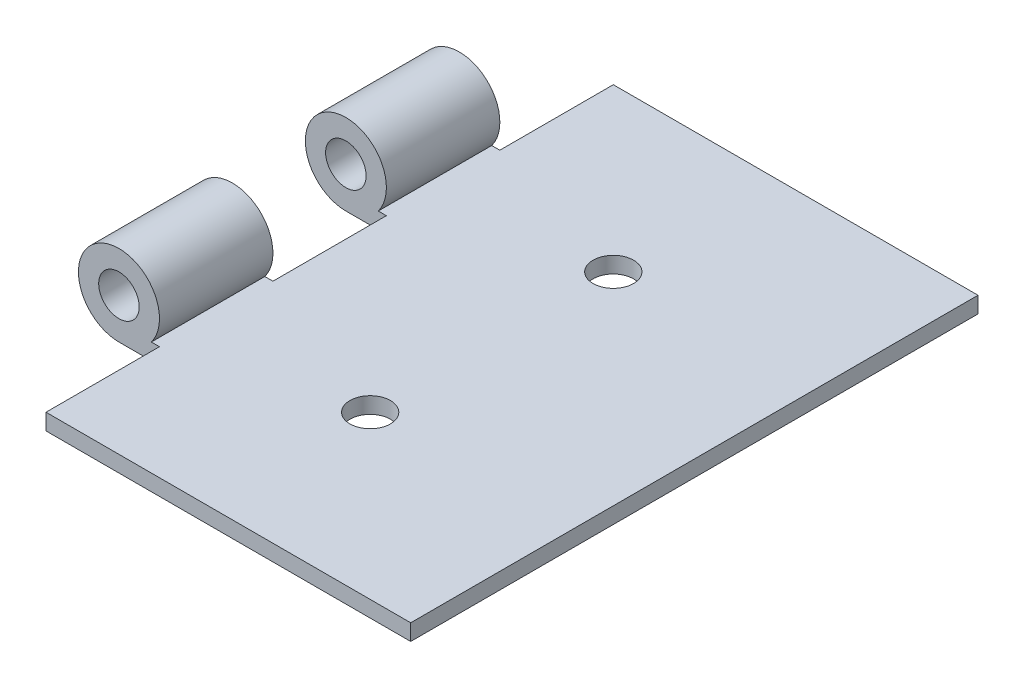
ISO-10303-21;
HEADER;
FILE_DESCRIPTION(('STEP AP214'),'2;1');
FILE_NAME('part.step','',(''),(''),'','','');
FILE_SCHEMA(('AUTOMOTIVE_DESIGN { 1 0 10303 214 1 1 1 1 }'));
ENDSEC;
DATA;
#1=APPLICATION_CONTEXT('core data for automotive mechanical design processes');
#2=APPLICATION_PROTOCOL_DEFINITION('international standard','automotive_design',2000,#1);
#3=PRODUCT_CONTEXT('',#1,'mechanical');
#4=PRODUCT('Part','Part','',(#3));
#5=PRODUCT_RELATED_PRODUCT_CATEGORY('part','',(#4));
#6=PRODUCT_DEFINITION_FORMATION('','',#4);
#7=PRODUCT_DEFINITION_CONTEXT('part definition',#1,'design');
#8=PRODUCT_DEFINITION('design','',#6,#7);
#9=PRODUCT_DEFINITION_SHAPE('','',#8);
#10=(LENGTH_UNIT() NAMED_UNIT(*) SI_UNIT(.MILLI.,.METRE.));
#11=(NAMED_UNIT(*) PLANE_ANGLE_UNIT() SI_UNIT($,.RADIAN.));
#12=(NAMED_UNIT(*) SI_UNIT($,.STERADIAN.) SOLID_ANGLE_UNIT());
#13=UNCERTAINTY_MEASURE_WITH_UNIT(LENGTH_MEASURE(1.E-05),#10,'distance_accuracy_value','');
#14=(GEOMETRIC_REPRESENTATION_CONTEXT(3) GLOBAL_UNCERTAINTY_ASSIGNED_CONTEXT((#13)) GLOBAL_UNIT_ASSIGNED_CONTEXT((#10,
#11,#12)) REPRESENTATION_CONTEXT('',''));
#15=CARTESIAN_POINT('',(0.,0.,0.));
#16=DIRECTION('',(0.,0.,1.));
#17=DIRECTION('',(1.,0.,0.));
#18=AXIS2_PLACEMENT_3D('',#15,#16,#17);
#19=CARTESIAN_POINT('',(-25.,5.,-49.142135623731));
#20=DIRECTION('',(0.,0.,1.));
#21=DIRECTION('',(1.,0.,0.));
#22=AXIS2_PLACEMENT_3D('',#19,#20,#21);
#23=CYLINDRICAL_SURFACE('',#22,5.);
#24=CARTESIAN_POINT('',(-25.,5.,7.00000000000001));
#25=DIRECTION('',(0.,0.,1.));
#26=DIRECTION('',(1.,0.,0.));
#27=AXIS2_PLACEMENT_3D('',#24,#25,#26);
#28=CIRCLE('',#27,5.);
#29=CARTESIAN_POINT('',(-25.,0.,7.00000000000001));
#30=VERTEX_POINT('',#29);
#31=CARTESIAN_POINT('',(-21.,2.,7.00000000000001));
#32=VERTEX_POINT('',#31);
#33=EDGE_CURVE('E204',#30,#32,#28,.F.);
#34=ORIENTED_EDGE('',*,*,#33,.F.);
#35=DIRECTION('',(0.,0.,1.));
#36=VECTOR('',#35,1.);
#37=CARTESIAN_POINT('',(-25.,0.,-35.));
#38=LINE('',#37,#36);
#39=CARTESIAN_POINT('',(-25.,0.,21.));
#40=VERTEX_POINT('',#39);
#41=EDGE_CURVE('E267',#30,#40,#38,.T.);
#42=ORIENTED_EDGE('',*,*,#41,.T.);
#43=CARTESIAN_POINT('',(-25.,5.,21.));
#44=DIRECTION('',(0.,0.,-1.));
#45=DIRECTION('',(-1.,0.,0.));
#46=AXIS2_PLACEMENT_3D('',#43,#44,#45);
#47=CIRCLE('',#46,5.);
#48=CARTESIAN_POINT('',(-21.,2.,21.));
#49=VERTEX_POINT('',#48);
#50=EDGE_CURVE('E197',#49,#40,#47,.F.);
#51=ORIENTED_EDGE('',*,*,#50,.F.);
#52=DIRECTION('',(0.,0.,1.));
#53=VECTOR('',#52,1.);
#54=CARTESIAN_POINT('',(-21.,2.,-49.142135623731));
#55=LINE('',#54,#53);
#56=EDGE_CURVE('E250',#49,#32,#55,.F.);
#57=ORIENTED_EDGE('',*,*,#56,.T.);
#58=EDGE_LOOP('',(#34,#42,#51,#57));
#59=FACE_BOUND('',#58,.T.);
#60=ADVANCED_FACE('F38',(#59),#23,.T.);
#61=CARTESIAN_POINT('',(25.,2.,-35.));
#62=DIRECTION('',(-1.,0.,0.));
#63=DIRECTION('',(0.,0.,1.));
#64=AXIS2_PLACEMENT_3D('',#61,#62,#63);
#65=PLANE('',#64);
#66=DIRECTION('',(0.,0.,-1.));
#67=VECTOR('',#66,1.);
#68=CARTESIAN_POINT('',(25.,0.,-35.));
#69=LINE('',#68,#67);
#70=CARTESIAN_POINT('',(25.,0.,35.));
#71=VERTEX_POINT('',#70);
#72=CARTESIAN_POINT('',(25.,0.,-35.));
#73=VERTEX_POINT('',#72);
#74=EDGE_CURVE('E261',#71,#73,#69,.T.);
#75=ORIENTED_EDGE('',*,*,#74,.T.);
#76=DIRECTION('',(0.,-1.,0.));
#77=VECTOR('',#76,1.);
#78=CARTESIAN_POINT('',(25.,2.,-35.));
#79=LINE('',#78,#77);
#80=CARTESIAN_POINT('',(25.,2.,-35.));
#81=VERTEX_POINT('',#80);
#82=EDGE_CURVE('E11',#81,#73,#79,.T.);
#83=ORIENTED_EDGE('',*,*,#82,.F.);
#84=DIRECTION('',(0.,0.,-1.));
#85=VECTOR('',#84,1.);
#86=CARTESIAN_POINT('',(25.,2.,-35.));
#87=LINE('',#86,#85);
#88=CARTESIAN_POINT('',(25.,2.,35.));
#89=VERTEX_POINT('',#88);
#90=EDGE_CURVE('E251',#89,#81,#87,.T.);
#91=ORIENTED_EDGE('',*,*,#90,.F.);
#92=DIRECTION('',(0.,-1.,0.));
#93=VECTOR('',#92,1.);
#94=CARTESIAN_POINT('',(25.,2.,35.));
#95=LINE('',#94,#93);
#96=EDGE_CURVE('E49',#89,#71,#95,.T.);
#97=ORIENTED_EDGE('',*,*,#96,.T.);
#98=EDGE_LOOP('',(#75,#83,#91,#97));
#99=FACE_BOUND('',#98,.T.);
#100=ADVANCED_FACE('F40',(#99),#65,.F.);
#101=CARTESIAN_POINT('',(-25.,2.,-35.));
#102=DIRECTION('',(0.,0.,1.));
#103=DIRECTION('',(1.,0.,0.));
#104=AXIS2_PLACEMENT_3D('',#101,#102,#103);
#105=PLANE('',#104);
#106=DIRECTION('',(-1.,0.,0.));
#107=VECTOR('',#106,1.);
#108=CARTESIAN_POINT('',(-25.,0.,-35.));
#109=LINE('',#108,#107);
#110=CARTESIAN_POINT('',(-20.,0.,-35.));
#111=VERTEX_POINT('',#110);
#112=EDGE_CURVE('E70',#73,#111,#109,.T.);
#113=ORIENTED_EDGE('',*,*,#112,.T.);
#114=DIRECTION('',(0.,1.,0.));
#115=VECTOR('',#114,1.);
#116=CARTESIAN_POINT('',(-20.,0.,-35.));
#117=LINE('',#116,#115);
#118=CARTESIAN_POINT('',(-20.,2.,-35.));
#119=VERTEX_POINT('',#118);
#120=EDGE_CURVE('E147',#111,#119,#117,.T.);
#121=ORIENTED_EDGE('',*,*,#120,.T.);
#122=DIRECTION('',(-1.,0.,0.));
#123=VECTOR('',#122,1.);
#124=CARTESIAN_POINT('',(-25.,2.,-35.));
#125=LINE('',#124,#123);
#126=EDGE_CURVE('E254',#81,#119,#125,.T.);
#127=ORIENTED_EDGE('',*,*,#126,.F.);
#128=ORIENTED_EDGE('',*,*,#82,.T.);
#129=EDGE_LOOP('',(#113,#121,#127,#128));
#130=FACE_BOUND('',#129,.T.);
#131=ADVANCED_FACE('F312',(#130),#105,.F.);
#132=CARTESIAN_POINT('',(-25.,2.,35.));
#133=DIRECTION('',(0.,0.,-1.));
#134=DIRECTION('',(-1.,0.,0.));
#135=AXIS2_PLACEMENT_3D('',#132,#133,#134);
#136=PLANE('',#135);
#137=DIRECTION('',(1.,0.,0.));
#138=VECTOR('',#137,1.);
#139=CARTESIAN_POINT('',(-25.,2.,35.));
#140=LINE('',#139,#138);
#141=CARTESIAN_POINT('',(-20.,2.,35.));
#142=VERTEX_POINT('',#141);
#143=EDGE_CURVE('E58',#142,#89,#140,.T.);
#144=ORIENTED_EDGE('',*,*,#143,.F.);
#145=DIRECTION('',(0.,1.,0.));
#146=VECTOR('',#145,1.);
#147=CARTESIAN_POINT('',(-20.,0.,35.));
#148=LINE('',#147,#146);
#149=CARTESIAN_POINT('',(-20.,0.,35.));
#150=VERTEX_POINT('',#149);
#151=EDGE_CURVE('E191',#150,#142,#148,.T.);
#152=ORIENTED_EDGE('',*,*,#151,.F.);
#153=DIRECTION('',(1.,0.,0.));
#154=VECTOR('',#153,1.);
#155=CARTESIAN_POINT('',(-25.,0.,35.));
#156=LINE('',#155,#154);
#157=EDGE_CURVE('E255',#150,#71,#156,.T.);
#158=ORIENTED_EDGE('',*,*,#157,.T.);
#159=ORIENTED_EDGE('',*,*,#96,.F.);
#160=EDGE_LOOP('',(#144,#152,#158,#159));
#161=FACE_BOUND('',#160,.T.);
#162=ADVANCED_FACE('F339',(#161),#136,.F.);
#163=CARTESIAN_POINT('',(0.,2.,0.));
#164=DIRECTION('',(0.,1.,0.));
#165=DIRECTION('',(0.,0.,1.));
#166=AXIS2_PLACEMENT_3D('',#163,#164,#165);
#167=PLANE('',#166);
#168=DIRECTION('',(0.,0.,-1.));
#169=VECTOR('',#168,1.);
#170=CARTESIAN_POINT('',(-20.,2.,0.));
#171=LINE('',#170,#169);
#172=CARTESIAN_POINT('',(-20.,2.,-21.));
#173=VERTEX_POINT('',#172);
#174=EDGE_CURVE('E78',#173,#119,#171,.T.);
#175=ORIENTED_EDGE('',*,*,#174,.F.);
#176=DIRECTION('',(1.,0.,0.));
#177=VECTOR('',#176,1.);
#178=CARTESIAN_POINT('',(0.,2.,-21.));
#179=LINE('',#178,#177);
#180=CARTESIAN_POINT('',(-21.,2.,-21.));
#181=VERTEX_POINT('',#180);
#182=EDGE_CURVE('E145',#181,#173,#179,.T.);
#183=ORIENTED_EDGE('',*,*,#182,.F.);
#184=CARTESIAN_POINT('',(-21.,2.,-6.99999999999999));
#185=VERTEX_POINT('',#184);
#186=EDGE_CURVE('E235',#185,#181,#55,.F.);
#187=ORIENTED_EDGE('',*,*,#186,.F.);
#188=DIRECTION('',(-1.,0.,0.));
#189=VECTOR('',#188,1.);
#190=CARTESIAN_POINT('',(0.,2.,-7.));
#191=LINE('',#190,#189);
#192=CARTESIAN_POINT('',(-20.,2.,-7.));
#193=VERTEX_POINT('',#192);
#194=EDGE_CURVE('E214',#193,#185,#191,.T.);
#195=ORIENTED_EDGE('',*,*,#194,.F.);
#196=DIRECTION('',(0.,0.,-1.));
#197=VECTOR('',#196,1.);
#198=CARTESIAN_POINT('',(-20.,2.,0.));
#199=LINE('',#198,#197);
#200=CARTESIAN_POINT('',(-20.,2.,7.00000000000001));
#201=VERTEX_POINT('',#200);
#202=EDGE_CURVE('E225',#201,#193,#199,.T.);
#203=ORIENTED_EDGE('',*,*,#202,.F.);
#204=DIRECTION('',(1.,0.,0.));
#205=VECTOR('',#204,1.);
#206=CARTESIAN_POINT('',(0.,2.,7.00000000000001));
#207=LINE('',#206,#205);
#208=EDGE_CURVE('E207',#32,#201,#207,.T.);
#209=ORIENTED_EDGE('',*,*,#208,.F.);
#210=ORIENTED_EDGE('',*,*,#56,.F.);
#211=DIRECTION('',(-1.,0.,0.));
#212=VECTOR('',#211,1.);
#213=CARTESIAN_POINT('',(0.,2.,21.));
#214=LINE('',#213,#212);
#215=CARTESIAN_POINT('',(-20.,2.,21.));
#216=VERTEX_POINT('',#215);
#217=EDGE_CURVE('E200',#216,#49,#214,.T.);
#218=ORIENTED_EDGE('',*,*,#217,.F.);
#219=DIRECTION('',(0.,0.,-1.));
#220=VECTOR('',#219,1.);
#221=CARTESIAN_POINT('',(-20.,2.,0.));
#222=LINE('',#221,#220);
#223=EDGE_CURVE('E222',#142,#216,#222,.T.);
#224=ORIENTED_EDGE('',*,*,#223,.F.);
#225=ORIENTED_EDGE('',*,*,#143,.T.);
#226=ORIENTED_EDGE('',*,*,#90,.T.);
#227=ORIENTED_EDGE('',*,*,#126,.T.);
#228=EDGE_LOOP('',(#175,#183,#187,#195,#203,#209,#210,#218,#224,#225,#226,#227));
#229=FACE_BOUND('',#228,.T.);
#230=CARTESIAN_POINT('',(0.,2.,-15.));
#231=DIRECTION('',(0.,1.,0.));
#232=DIRECTION('',(0.,0.,1.));
#233=AXIS2_PLACEMENT_3D('',#230,#231,#232);
#234=CIRCLE('',#233,2.5);
#235=CARTESIAN_POINT('',(0.,2.,-12.5));
#236=VERTEX_POINT('',#235);
#237=EDGE_CURVE('E236',#236,#236,#234,.T.);
#238=ORIENTED_EDGE('',*,*,#237,.F.);
#239=EDGE_LOOP('',(#238));
#240=FACE_BOUND('',#239,.T.);
#241=CARTESIAN_POINT('',(0.,2.,15.));
#242=DIRECTION('',(0.,1.,0.));
#243=DIRECTION('',(0.,0.,1.));
#244=AXIS2_PLACEMENT_3D('',#241,#242,#243);
#245=CIRCLE('',#244,2.5);
#246=CARTESIAN_POINT('',(0.,2.,17.5));
#247=VERTEX_POINT('',#246);
#248=EDGE_CURVE('E230',#247,#247,#245,.T.);
#249=ORIENTED_EDGE('',*,*,#248,.F.);
#250=EDGE_LOOP('',(#249));
#251=FACE_BOUND('',#250,.T.);
#252=ADVANCED_FACE('F326',(#229,#240,#251),#167,.T.);
#253=CARTESIAN_POINT('',(0.,0.,0.));
#254=DIRECTION('',(0.,1.,0.));
#255=DIRECTION('',(0.,0.,1.));
#256=AXIS2_PLACEMENT_3D('',#253,#254,#255);
#257=PLANE('',#256);
#258=CARTESIAN_POINT('',(0.,0.,-15.));
#259=DIRECTION('',(0.,1.,0.));
#260=DIRECTION('',(0.,0.,1.));
#261=AXIS2_PLACEMENT_3D('',#258,#259,#260);
#262=CIRCLE('',#261,2.5);
#263=CARTESIAN_POINT('',(0.,0.,-12.5));
#264=VERTEX_POINT('',#263);
#265=EDGE_CURVE('E231',#264,#264,#262,.T.);
#266=ORIENTED_EDGE('',*,*,#265,.T.);
#267=EDGE_LOOP('',(#266));
#268=FACE_BOUND('',#267,.T.);
#269=CARTESIAN_POINT('',(0.,0.,15.));
#270=DIRECTION('',(0.,1.,0.));
#271=DIRECTION('',(0.,0.,1.));
#272=AXIS2_PLACEMENT_3D('',#269,#270,#271);
#273=CIRCLE('',#272,2.5);
#274=CARTESIAN_POINT('',(0.,0.,17.5));
#275=VERTEX_POINT('',#274);
#276=EDGE_CURVE('E240',#275,#275,#273,.T.);
#277=ORIENTED_EDGE('',*,*,#276,.T.);
#278=EDGE_LOOP('',(#277));
#279=FACE_BOUND('',#278,.T.);
#280=DIRECTION('',(1.,0.,0.));
#281=VECTOR('',#280,1.);
#282=CARTESIAN_POINT('',(-30.,0.,-21.));
#283=LINE('',#282,#281);
#284=CARTESIAN_POINT('',(-25.,0.,-21.));
#285=VERTEX_POINT('',#284);
#286=CARTESIAN_POINT('',(-20.,0.,-21.));
#287=VERTEX_POINT('',#286);
#288=EDGE_CURVE('E142',#285,#287,#283,.T.);
#289=ORIENTED_EDGE('',*,*,#288,.T.);
#290=DIRECTION('',(0.,0.,-1.));
#291=VECTOR('',#290,1.);
#292=CARTESIAN_POINT('',(-20.,0.,-35.));
#293=LINE('',#292,#291);
#294=EDGE_CURVE('E148',#287,#111,#293,.T.);
#295=ORIENTED_EDGE('',*,*,#294,.T.);
#296=ORIENTED_EDGE('',*,*,#112,.F.);
#297=ORIENTED_EDGE('',*,*,#74,.F.);
#298=ORIENTED_EDGE('',*,*,#157,.F.);
#299=DIRECTION('',(0.,0.,-1.));
#300=VECTOR('',#299,1.);
#301=CARTESIAN_POINT('',(-20.,0.,35.));
#302=LINE('',#301,#300);
#303=CARTESIAN_POINT('',(-20.,0.,21.));
#304=VERTEX_POINT('',#303);
#305=EDGE_CURVE('E183',#150,#304,#302,.T.);
#306=ORIENTED_EDGE('',*,*,#305,.T.);
#307=DIRECTION('',(-1.,0.,0.));
#308=VECTOR('',#307,1.);
#309=CARTESIAN_POINT('',(-30.,0.,21.));
#310=LINE('',#309,#308);
#311=EDGE_CURVE('E187',#304,#40,#310,.T.);
#312=ORIENTED_EDGE('',*,*,#311,.T.);
#313=ORIENTED_EDGE('',*,*,#41,.F.);
#314=DIRECTION('',(1.,0.,0.));
#315=VECTOR('',#314,1.);
#316=CARTESIAN_POINT('',(-30.,0.,7.));
#317=LINE('',#316,#315);
#318=CARTESIAN_POINT('',(-20.,0.,7.00000000000001));
#319=VERTEX_POINT('',#318);
#320=EDGE_CURVE('E168',#30,#319,#317,.T.);
#321=ORIENTED_EDGE('',*,*,#320,.T.);
#322=DIRECTION('',(0.,0.,-1.));
#323=VECTOR('',#322,1.);
#324=CARTESIAN_POINT('',(-20.,0.,-7.));
#325=LINE('',#324,#323);
#326=CARTESIAN_POINT('',(-20.,0.,-7.));
#327=VERTEX_POINT('',#326);
#328=EDGE_CURVE('E172',#319,#327,#325,.T.);
#329=ORIENTED_EDGE('',*,*,#328,.T.);
#330=DIRECTION('',(-1.,0.,0.));
#331=VECTOR('',#330,1.);
#332=CARTESIAN_POINT('',(-30.,0.,-7.));
#333=LINE('',#332,#331);
#334=CARTESIAN_POINT('',(-25.,0.,-7.));
#335=VERTEX_POINT('',#334);
#336=EDGE_CURVE('E177',#327,#335,#333,.T.);
#337=ORIENTED_EDGE('',*,*,#336,.T.);
#338=EDGE_CURVE('E156',#285,#335,#38,.T.);
#339=ORIENTED_EDGE('',*,*,#338,.F.);
#340=EDGE_LOOP('',(#289,#295,#296,#297,#298,#306,#312,#313,#321,#329,#337,#339));
#341=FACE_BOUND('',#340,.T.);
#342=ADVANCED_FACE('F153',(#268,#279,#341),#257,.F.);
#343=CARTESIAN_POINT('',(-25.,5.,-21.));
#344=DIRECTION('',(0.,0.,1.));
#345=DIRECTION('',(1.,0.,0.));
#346=AXIS2_PLACEMENT_3D('',#343,#344,#345);
#347=CIRCLE('',#346,5.);
#348=EDGE_CURVE('E217',#285,#181,#347,.F.);
#349=ORIENTED_EDGE('',*,*,#348,.F.);
#350=ORIENTED_EDGE('',*,*,#338,.T.);
#351=CARTESIAN_POINT('',(-25.,5.,-6.99999999999999));
#352=DIRECTION('',(0.,0.,-1.));
#353=DIRECTION('',(-1.,0.,0.));
#354=AXIS2_PLACEMENT_3D('',#351,#352,#353);
#355=CIRCLE('',#354,5.);
#356=EDGE_CURVE('E211',#185,#335,#355,.F.);
#357=ORIENTED_EDGE('',*,*,#356,.F.);
#358=ORIENTED_EDGE('',*,*,#186,.T.);
#359=EDGE_LOOP('',(#349,#350,#357,#358));
#360=FACE_BOUND('',#359,.T.);
#361=ADVANCED_FACE('F308',(#360),#23,.T.);
#362=CARTESIAN_POINT('',(0.,0.,15.));
#363=DIRECTION('',(0.,1.,0.));
#364=DIRECTION('',(0.,0.,1.));
#365=AXIS2_PLACEMENT_3D('',#362,#363,#364);
#366=CYLINDRICAL_SURFACE('',#365,2.5);
#367=ORIENTED_EDGE('',*,*,#276,.F.);
#368=EDGE_LOOP('',(#367));
#369=FACE_BOUND('',#368,.T.);
#370=ORIENTED_EDGE('',*,*,#248,.T.);
#371=EDGE_LOOP('',(#370));
#372=FACE_BOUND('',#371,.T.);
#373=ADVANCED_FACE('F317',(#369,#372),#366,.F.);
#374=CARTESIAN_POINT('',(0.,0.,-15.));
#375=DIRECTION('',(0.,1.,0.));
#376=DIRECTION('',(0.,0.,1.));
#377=AXIS2_PLACEMENT_3D('',#374,#375,#376);
#378=CYLINDRICAL_SURFACE('',#377,2.5);
#379=ORIENTED_EDGE('',*,*,#265,.F.);
#380=EDGE_LOOP('',(#379));
#381=FACE_BOUND('',#380,.T.);
#382=ORIENTED_EDGE('',*,*,#237,.T.);
#383=EDGE_LOOP('',(#382));
#384=FACE_BOUND('',#383,.T.);
#385=ADVANCED_FACE('F323',(#381,#384),#378,.F.);
#386=CARTESIAN_POINT('',(-30.,0.,21.));
#387=DIRECTION('',(0.,0.,-1.));
#388=DIRECTION('',(-1.,0.,0.));
#389=AXIS2_PLACEMENT_3D('',#386,#387,#388);
#390=PLANE('',#389);
#391=ORIENTED_EDGE('',*,*,#217,.T.);
#392=ORIENTED_EDGE('',*,*,#50,.T.);
#393=ORIENTED_EDGE('',*,*,#311,.F.);
#394=DIRECTION('',(0.,1.,0.));
#395=VECTOR('',#394,1.);
#396=CARTESIAN_POINT('',(-20.,0.,21.));
#397=LINE('',#396,#395);
#398=EDGE_CURVE('E173',#304,#216,#397,.T.);
#399=ORIENTED_EDGE('',*,*,#398,.T.);
#400=EDGE_LOOP('',(#391,#392,#393,#399));
#401=FACE_BOUND('',#400,.T.);
#402=CARTESIAN_POINT('',(-25.,5.,21.));
#403=DIRECTION('',(0.,0.,-1.));
#404=DIRECTION('',(-1.,0.,0.));
#405=AXIS2_PLACEMENT_3D('',#402,#403,#404);
#406=CIRCLE('',#405,2.5);
#407=CARTESIAN_POINT('',(-27.5,5.,21.));
#408=VERTEX_POINT('',#407);
#409=EDGE_CURVE('E166',#408,#408,#406,.F.);
#410=ORIENTED_EDGE('',*,*,#409,.F.);
#411=EDGE_LOOP('',(#410));
#412=FACE_BOUND('',#411,.T.);
#413=ADVANCED_FACE('F300',(#401,#412),#390,.F.);
#414=CARTESIAN_POINT('',(-20.,0.,35.));
#415=DIRECTION('',(1.,0.,0.));
#416=DIRECTION('',(0.,0.,-1.));
#417=AXIS2_PLACEMENT_3D('',#414,#415,#416);
#418=PLANE('',#417);
#419=ORIENTED_EDGE('',*,*,#223,.T.);
#420=ORIENTED_EDGE('',*,*,#398,.F.);
#421=ORIENTED_EDGE('',*,*,#305,.F.);
#422=ORIENTED_EDGE('',*,*,#151,.T.);
#423=EDGE_LOOP('',(#419,#420,#421,#422));
#424=FACE_BOUND('',#423,.T.);
#425=ADVANCED_FACE('F290',(#424),#418,.F.);
#426=CARTESIAN_POINT('',(-30.,0.,-7.));
#427=DIRECTION('',(0.,0.,-1.));
#428=DIRECTION('',(-1.,0.,0.));
#429=AXIS2_PLACEMENT_3D('',#426,#427,#428);
#430=PLANE('',#429);
#431=ORIENTED_EDGE('',*,*,#194,.T.);
#432=ORIENTED_EDGE('',*,*,#356,.T.);
#433=ORIENTED_EDGE('',*,*,#336,.F.);
#434=DIRECTION('',(0.,1.,0.));
#435=VECTOR('',#434,1.);
#436=CARTESIAN_POINT('',(-20.,0.,-7.));
#437=LINE('',#436,#435);
#438=EDGE_CURVE('E158',#327,#193,#437,.T.);
#439=ORIENTED_EDGE('',*,*,#438,.T.);
#440=EDGE_LOOP('',(#431,#432,#433,#439));
#441=FACE_BOUND('',#440,.T.);
#442=CARTESIAN_POINT('',(-25.,5.,-6.99999999999999));
#443=DIRECTION('',(0.,0.,-1.));
#444=DIRECTION('',(-1.,0.,0.));
#445=AXIS2_PLACEMENT_3D('',#442,#443,#444);
#446=CIRCLE('',#445,2.5);
#447=CARTESIAN_POINT('',(-27.5,5.,-6.99999999999999));
#448=VERTEX_POINT('',#447);
#449=EDGE_CURVE('E210',#448,#448,#446,.F.);
#450=ORIENTED_EDGE('',*,*,#449,.F.);
#451=EDGE_LOOP('',(#450));
#452=FACE_BOUND('',#451,.T.);
#453=ADVANCED_FACE('F287',(#441,#452),#430,.F.);
#454=CARTESIAN_POINT('',(-30.,0.,7.));
#455=DIRECTION('',(0.,0.,1.));
#456=DIRECTION('',(1.,0.,0.));
#457=AXIS2_PLACEMENT_3D('',#454,#455,#456);
#458=PLANE('',#457);
#459=ORIENTED_EDGE('',*,*,#208,.T.);
#460=DIRECTION('',(0.,1.,0.));
#461=VECTOR('',#460,1.);
#462=CARTESIAN_POINT('',(-20.,0.,7.00000000000001));
#463=LINE('',#462,#461);
#464=EDGE_CURVE('E162',#319,#201,#463,.T.);
#465=ORIENTED_EDGE('',*,*,#464,.F.);
#466=ORIENTED_EDGE('',*,*,#320,.F.);
#467=ORIENTED_EDGE('',*,*,#33,.T.);
#468=EDGE_LOOP('',(#459,#465,#466,#467));
#469=FACE_BOUND('',#468,.T.);
#470=CARTESIAN_POINT('',(-25.,5.,7.00000000000001));
#471=DIRECTION('',(0.,0.,1.));
#472=DIRECTION('',(1.,0.,0.));
#473=AXIS2_PLACEMENT_3D('',#470,#471,#472);
#474=CIRCLE('',#473,2.5);
#475=CARTESIAN_POINT('',(-22.5,5.,7.00000000000001));
#476=VERTEX_POINT('',#475);
#477=EDGE_CURVE('E203',#476,#476,#474,.F.);
#478=ORIENTED_EDGE('',*,*,#477,.F.);
#479=EDGE_LOOP('',(#478));
#480=FACE_BOUND('',#479,.T.);
#481=ADVANCED_FACE('F289',(#469,#480),#458,.F.);
#482=CARTESIAN_POINT('',(-20.,0.,-7.));
#483=DIRECTION('',(1.,0.,0.));
#484=DIRECTION('',(0.,0.,-1.));
#485=AXIS2_PLACEMENT_3D('',#482,#483,#484);
#486=PLANE('',#485);
#487=ORIENTED_EDGE('',*,*,#202,.T.);
#488=ORIENTED_EDGE('',*,*,#438,.F.);
#489=ORIENTED_EDGE('',*,*,#328,.F.);
#490=ORIENTED_EDGE('',*,*,#464,.T.);
#491=EDGE_LOOP('',(#487,#488,#489,#490));
#492=FACE_BOUND('',#491,.T.);
#493=ADVANCED_FACE('F297',(#492),#486,.F.);
#494=CARTESIAN_POINT('',(-25.,5.,-49.142135623731));
#495=DIRECTION('',(0.,0.,1.));
#496=DIRECTION('',(1.,0.,0.));
#497=AXIS2_PLACEMENT_3D('',#494,#495,#496);
#498=CYLINDRICAL_SURFACE('',#497,2.5);
#499=CARTESIAN_POINT('',(-25.,5.,-21.));
#500=DIRECTION('',(0.,0.,1.));
#501=DIRECTION('',(1.,0.,0.));
#502=AXIS2_PLACEMENT_3D('',#499,#500,#501);
#503=CIRCLE('',#502,2.5);
#504=CARTESIAN_POINT('',(-22.5,5.,-21.));
#505=VERTEX_POINT('',#504);
#506=EDGE_CURVE('E42',#505,#505,#503,.F.);
#507=ORIENTED_EDGE('',*,*,#506,.T.);
#508=EDGE_LOOP('',(#507));
#509=FACE_BOUND('',#508,.T.);
#510=ORIENTED_EDGE('',*,*,#449,.T.);
#511=EDGE_LOOP('',(#510));
#512=FACE_BOUND('',#511,.T.);
#513=ADVANCED_FACE('F285',(#509,#512),#498,.F.);
#514=CARTESIAN_POINT('',(-30.,0.,-21.));
#515=DIRECTION('',(0.,0.,1.));
#516=DIRECTION('',(1.,0.,0.));
#517=AXIS2_PLACEMENT_3D('',#514,#515,#516);
#518=PLANE('',#517);
#519=ORIENTED_EDGE('',*,*,#182,.T.);
#520=DIRECTION('',(0.,1.,0.));
#521=VECTOR('',#520,1.);
#522=CARTESIAN_POINT('',(-20.,0.,-21.));
#523=LINE('',#522,#521);
#524=EDGE_CURVE('E137',#287,#173,#523,.T.);
#525=ORIENTED_EDGE('',*,*,#524,.F.);
#526=ORIENTED_EDGE('',*,*,#288,.F.);
#527=ORIENTED_EDGE('',*,*,#348,.T.);
#528=EDGE_LOOP('',(#519,#525,#526,#527));
#529=FACE_BOUND('',#528,.T.);
#530=ORIENTED_EDGE('',*,*,#506,.F.);
#531=EDGE_LOOP('',(#530));
#532=FACE_BOUND('',#531,.T.);
#533=ADVANCED_FACE('F139',(#529,#532),#518,.F.);
#534=CARTESIAN_POINT('',(-20.,0.,-35.));
#535=DIRECTION('',(1.,0.,0.));
#536=DIRECTION('',(0.,0.,-1.));
#537=AXIS2_PLACEMENT_3D('',#534,#535,#536);
#538=PLANE('',#537);
#539=ORIENTED_EDGE('',*,*,#174,.T.);
#540=ORIENTED_EDGE('',*,*,#120,.F.);
#541=ORIENTED_EDGE('',*,*,#294,.F.);
#542=ORIENTED_EDGE('',*,*,#524,.T.);
#543=EDGE_LOOP('',(#539,#540,#541,#542));
#544=FACE_BOUND('',#543,.T.);
#545=ADVANCED_FACE('F150',(#544),#538,.F.);
#546=ORIENTED_EDGE('',*,*,#477,.T.);
#547=EDGE_LOOP('',(#546));
#548=FACE_BOUND('',#547,.T.);
#549=ORIENTED_EDGE('',*,*,#409,.T.);
#550=EDGE_LOOP('',(#549));
#551=FACE_BOUND('',#550,.T.);
#552=ADVANCED_FACE('F360',(#548,#551),#498,.F.);
#553=CLOSED_SHELL('',(#60,#100,#131,#162,#252,#342,#361,#373,#385,#413,#425,#453,#481,#493,#513,
#533,#545,#552));
#554=MANIFOLD_SOLID_BREP('B2',#553);
#555=ADVANCED_BREP_SHAPE_REPRESENTATION('',(#18,#554),#14);
#556=SHAPE_DEFINITION_REPRESENTATION(#9,#555);
ENDSEC;
END-ISO-10303-21;
